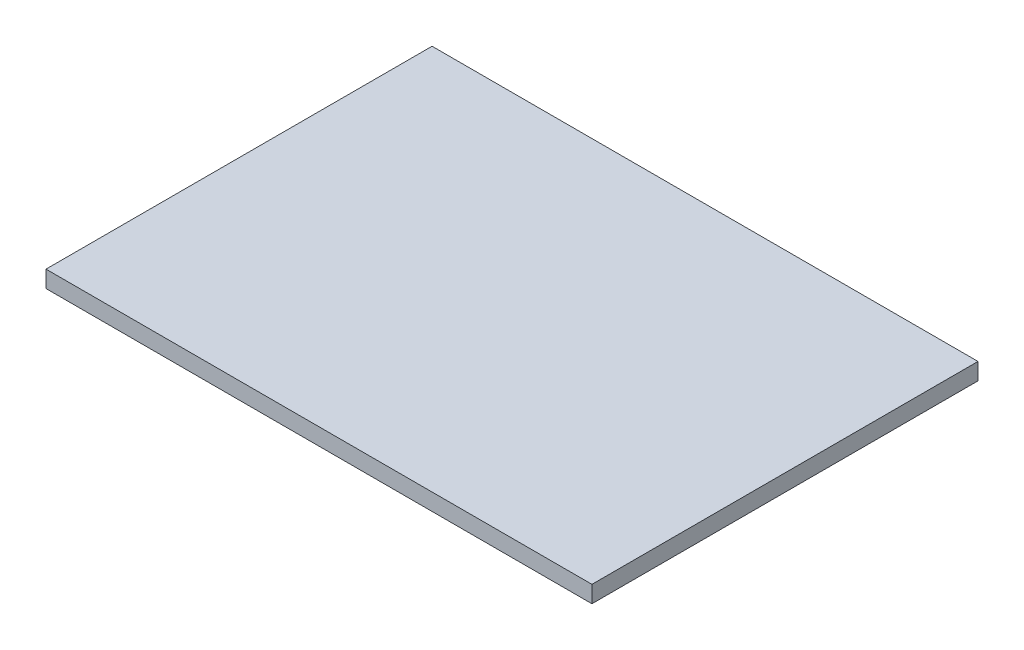
ISO-10303-21;
HEADER;
FILE_DESCRIPTION(('STEP AP214'),'2;1');
FILE_NAME('part.step','',(''),(''),'','','');
FILE_SCHEMA(('AUTOMOTIVE_DESIGN { 1 0 10303 214 1 1 1 1 }'));
ENDSEC;
DATA;
#1=APPLICATION_CONTEXT('core data for automotive mechanical design processes');
#2=APPLICATION_PROTOCOL_DEFINITION('international standard','automotive_design',2000,#1);
#3=PRODUCT_CONTEXT('',#1,'mechanical');
#4=PRODUCT('Part','Part','',(#3));
#5=PRODUCT_RELATED_PRODUCT_CATEGORY('part','',(#4));
#6=PRODUCT_DEFINITION_FORMATION('','',#4);
#7=PRODUCT_DEFINITION_CONTEXT('part definition',#1,'design');
#8=PRODUCT_DEFINITION('design','',#6,#7);
#9=PRODUCT_DEFINITION_SHAPE('','',#8);
#10=(LENGTH_UNIT() NAMED_UNIT(*) SI_UNIT(.MILLI.,.METRE.));
#11=(NAMED_UNIT(*) PLANE_ANGLE_UNIT() SI_UNIT($,.RADIAN.));
#12=(NAMED_UNIT(*) SI_UNIT($,.STERADIAN.) SOLID_ANGLE_UNIT());
#13=UNCERTAINTY_MEASURE_WITH_UNIT(LENGTH_MEASURE(1.E-05),#10,'distance_accuracy_value','');
#14=(GEOMETRIC_REPRESENTATION_CONTEXT(3) GLOBAL_UNCERTAINTY_ASSIGNED_CONTEXT((#13)) GLOBAL_UNIT_ASSIGNED_CONTEXT((#10,
#11,#12)) REPRESENTATION_CONTEXT('',''));
#15=CARTESIAN_POINT('',(0.,0.,0.));
#16=DIRECTION('',(0.,0.,1.));
#17=DIRECTION('',(1.,0.,0.));
#18=AXIS2_PLACEMENT_3D('',#15,#16,#17);
#19=CARTESIAN_POINT('',(105.,10.,74.25));
#20=DIRECTION('',(-1.,0.,0.));
#21=DIRECTION('',(0.,0.,1.));
#22=AXIS2_PLACEMENT_3D('',#19,#20,#21);
#23=PLANE('',#22);
#24=DIRECTION('',(0.,-1.,0.));
#25=VECTOR('',#24,1.);
#26=CARTESIAN_POINT('',(105.,10.,-74.25));
#27=LINE('',#26,#25);
#28=CARTESIAN_POINT('',(105.,6.47799000364032,-74.25));
#29=VERTEX_POINT('',#28);
#30=CARTESIAN_POINT('',(105.,0.,-74.25));
#31=VERTEX_POINT('',#30);
#32=EDGE_CURVE('E40',#29,#31,#27,.T.);
#33=ORIENTED_EDGE('',*,*,#32,.F.);
#34=DIRECTION('',(0.,0.,1.));
#35=VECTOR('',#34,1.);
#36=CARTESIAN_POINT('',(105.,6.47799000364032,-74.25));
#37=LINE('',#36,#35);
#38=CARTESIAN_POINT('',(105.,6.47799000364032,74.25));
#39=VERTEX_POINT('',#38);
#40=EDGE_CURVE('E74',#29,#39,#37,.T.);
#41=ORIENTED_EDGE('',*,*,#40,.T.);
#42=DIRECTION('',(0.,-1.,0.));
#43=VECTOR('',#42,1.);
#44=CARTESIAN_POINT('',(105.,10.,74.25));
#45=LINE('',#44,#43);
#46=CARTESIAN_POINT('',(105.,0.,74.25));
#47=VERTEX_POINT('',#46);
#48=EDGE_CURVE('E54',#39,#47,#45,.T.);
#49=ORIENTED_EDGE('',*,*,#48,.T.);
#50=DIRECTION('',(0.,0.,-1.));
#51=VECTOR('',#50,1.);
#52=CARTESIAN_POINT('',(105.,0.,74.25));
#53=LINE('',#52,#51);
#54=EDGE_CURVE('E100',#47,#31,#53,.T.);
#55=ORIENTED_EDGE('',*,*,#54,.T.);
#56=EDGE_LOOP('',(#33,#41,#49,#55));
#57=FACE_BOUND('',#56,.T.);
#58=ADVANCED_FACE('F33',(#57),#23,.F.);
#59=CARTESIAN_POINT('',(-105.,10.,-74.25));
#60=DIRECTION('',(0.,0.,1.));
#61=DIRECTION('',(1.,0.,0.));
#62=AXIS2_PLACEMENT_3D('',#59,#60,#61);
#63=PLANE('',#62);
#64=DIRECTION('',(0.,-1.,0.));
#65=VECTOR('',#64,1.);
#66=CARTESIAN_POINT('',(-105.,10.,-74.25));
#67=LINE('',#66,#65);
#68=CARTESIAN_POINT('',(-105.,6.47799000364032,-74.25));
#69=VERTEX_POINT('',#68);
#70=CARTESIAN_POINT('',(-105.,0.,-74.25));
#71=VERTEX_POINT('',#70);
#72=EDGE_CURVE('E83',#69,#71,#67,.T.);
#73=ORIENTED_EDGE('',*,*,#72,.F.);
#74=DIRECTION('',(1.,0.,0.));
#75=VECTOR('',#74,1.);
#76=CARTESIAN_POINT('',(-105.,6.47799000364032,-74.25));
#77=LINE('',#76,#75);
#78=EDGE_CURVE('E72',#69,#29,#77,.T.);
#79=ORIENTED_EDGE('',*,*,#78,.T.);
#80=ORIENTED_EDGE('',*,*,#32,.T.);
#81=DIRECTION('',(-1.,0.,0.));
#82=VECTOR('',#81,1.);
#83=CARTESIAN_POINT('',(-105.,0.,-74.25));
#84=LINE('',#83,#82);
#85=EDGE_CURVE('E89',#31,#71,#84,.T.);
#86=ORIENTED_EDGE('',*,*,#85,.T.);
#87=EDGE_LOOP('',(#73,#79,#80,#86));
#88=FACE_BOUND('',#87,.T.);
#89=ADVANCED_FACE('F87',(#88),#63,.F.);
#90=CARTESIAN_POINT('',(-105.,10.,74.25));
#91=DIRECTION('',(1.,0.,0.));
#92=DIRECTION('',(0.,0.,-1.));
#93=AXIS2_PLACEMENT_3D('',#90,#91,#92);
#94=PLANE('',#93);
#95=DIRECTION('',(0.,-1.,0.));
#96=VECTOR('',#95,1.);
#97=CARTESIAN_POINT('',(-105.,10.,74.25));
#98=LINE('',#97,#96);
#99=CARTESIAN_POINT('',(-105.,6.47799000364032,74.25));
#100=VERTEX_POINT('',#99);
#101=CARTESIAN_POINT('',(-105.,0.,74.25));
#102=VERTEX_POINT('',#101);
#103=EDGE_CURVE('E85',#100,#102,#98,.T.);
#104=ORIENTED_EDGE('',*,*,#103,.F.);
#105=DIRECTION('',(0.,0.,1.));
#106=VECTOR('',#105,1.);
#107=CARTESIAN_POINT('',(-105.,6.47799000364032,-74.25));
#108=LINE('',#107,#106);
#109=EDGE_CURVE('E47',#69,#100,#108,.T.);
#110=ORIENTED_EDGE('',*,*,#109,.F.);
#111=ORIENTED_EDGE('',*,*,#72,.T.);
#112=DIRECTION('',(0.,0.,1.));
#113=VECTOR('',#112,1.);
#114=CARTESIAN_POINT('',(-105.,0.,74.25));
#115=LINE('',#114,#113);
#116=EDGE_CURVE('E97',#71,#102,#115,.T.);
#117=ORIENTED_EDGE('',*,*,#116,.T.);
#118=EDGE_LOOP('',(#104,#110,#111,#117));
#119=FACE_BOUND('',#118,.T.);
#120=ADVANCED_FACE('F81',(#119),#94,.F.);
#121=CARTESIAN_POINT('',(-105.,10.,74.25));
#122=DIRECTION('',(0.,0.,-1.));
#123=DIRECTION('',(-1.,0.,0.));
#124=AXIS2_PLACEMENT_3D('',#121,#122,#123);
#125=PLANE('',#124);
#126=ORIENTED_EDGE('',*,*,#48,.F.);
#127=DIRECTION('',(-1.,0.,0.));
#128=VECTOR('',#127,1.);
#129=CARTESIAN_POINT('',(-105.,6.47799000364032,74.25));
#130=LINE('',#129,#128);
#131=EDGE_CURVE('E11',#39,#100,#130,.T.);
#132=ORIENTED_EDGE('',*,*,#131,.T.);
#133=ORIENTED_EDGE('',*,*,#103,.T.);
#134=DIRECTION('',(1.,0.,0.));
#135=VECTOR('',#134,1.);
#136=CARTESIAN_POINT('',(-105.,0.,74.25));
#137=LINE('',#136,#135);
#138=EDGE_CURVE('E95',#102,#47,#137,.T.);
#139=ORIENTED_EDGE('',*,*,#138,.T.);
#140=EDGE_LOOP('',(#126,#132,#133,#139));
#141=FACE_BOUND('',#140,.T.);
#142=ADVANCED_FACE('F103',(#141),#125,.F.);
#143=CARTESIAN_POINT('',(0.,0.,0.));
#144=DIRECTION('',(0.,-1.,0.));
#145=DIRECTION('',(0.,0.,-1.));
#146=AXIS2_PLACEMENT_3D('',#143,#144,#145);
#147=PLANE('',#146);
#148=ORIENTED_EDGE('',*,*,#54,.F.);
#149=ORIENTED_EDGE('',*,*,#138,.F.);
#150=ORIENTED_EDGE('',*,*,#116,.F.);
#151=ORIENTED_EDGE('',*,*,#85,.F.);
#152=EDGE_LOOP('',(#148,#149,#150,#151));
#153=FACE_BOUND('',#152,.T.);
#154=ADVANCED_FACE('F107',(#153),#147,.T.);
#155=CARTESIAN_POINT('',(-105.,6.47799000364032,-74.25));
#156=DIRECTION('',(0.,-1.,0.));
#157=DIRECTION('',(0.,0.,-1.));
#158=AXIS2_PLACEMENT_3D('',#155,#156,#157);
#159=PLANE('',#158);
#160=ORIENTED_EDGE('',*,*,#40,.F.);
#161=ORIENTED_EDGE('',*,*,#78,.F.);
#162=ORIENTED_EDGE('',*,*,#109,.T.);
#163=ORIENTED_EDGE('',*,*,#131,.F.);
#164=EDGE_LOOP('',(#160,#161,#162,#163));
#165=FACE_BOUND('',#164,.T.);
#166=ADVANCED_FACE('F73',(#165),#159,.F.);
#167=CLOSED_SHELL('',(#58,#89,#120,#142,#154,#166));
#168=MANIFOLD_SOLID_BREP('B2',#167);
#169=ADVANCED_BREP_SHAPE_REPRESENTATION('',(#18,#168),#14);
#170=SHAPE_DEFINITION_REPRESENTATION(#9,#169);
ENDSEC;
END-ISO-10303-21;
